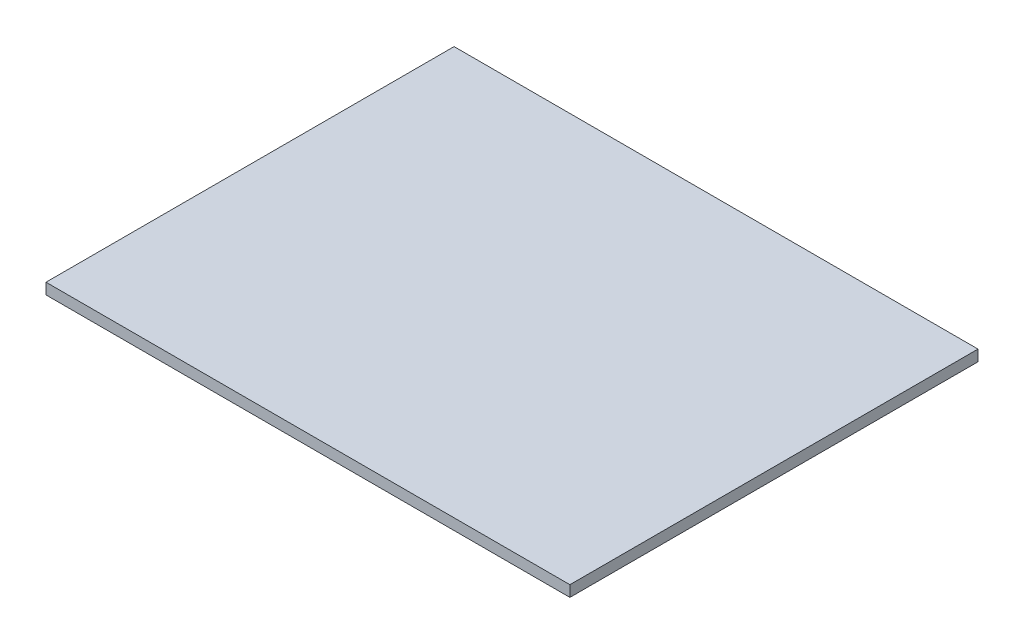
ISO-10303-21;
HEADER;
FILE_DESCRIPTION(('STEP AP214'),'2;1');
FILE_NAME('part.step','',(''),(''),'','','');
FILE_SCHEMA(('AUTOMOTIVE_DESIGN { 1 0 10303 214 1 1 1 1 }'));
ENDSEC;
DATA;
#1=APPLICATION_CONTEXT('core data for automotive mechanical design processes');
#2=APPLICATION_PROTOCOL_DEFINITION('international standard','automotive_design',2000,#1);
#3=PRODUCT_CONTEXT('',#1,'mechanical');
#4=PRODUCT('Part','Part','',(#3));
#5=PRODUCT_RELATED_PRODUCT_CATEGORY('part','',(#4));
#6=PRODUCT_DEFINITION_FORMATION('','',#4);
#7=PRODUCT_DEFINITION_CONTEXT('part definition',#1,'design');
#8=PRODUCT_DEFINITION('design','',#6,#7);
#9=PRODUCT_DEFINITION_SHAPE('','',#8);
#10=(LENGTH_UNIT() NAMED_UNIT(*) SI_UNIT(.MILLI.,.METRE.));
#11=(NAMED_UNIT(*) PLANE_ANGLE_UNIT() SI_UNIT($,.RADIAN.));
#12=(NAMED_UNIT(*) SI_UNIT($,.STERADIAN.) SOLID_ANGLE_UNIT());
#13=UNCERTAINTY_MEASURE_WITH_UNIT(LENGTH_MEASURE(1.E-05),#10,'distance_accuracy_value','');
#14=(GEOMETRIC_REPRESENTATION_CONTEXT(3) GLOBAL_UNCERTAINTY_ASSIGNED_CONTEXT((#13)) GLOBAL_UNIT_ASSIGNED_CONTEXT((#10,
#11,#12)) REPRESENTATION_CONTEXT('',''));
#15=CARTESIAN_POINT('',(0.,0.,0.));
#16=DIRECTION('',(0.,0.,1.));
#17=DIRECTION('',(1.,0.,0.));
#18=AXIS2_PLACEMENT_3D('',#15,#16,#17);
#19=CARTESIAN_POINT('',(237.5,10.,-185.));
#20=DIRECTION('',(-1.,0.,0.));
#21=DIRECTION('',(0.,0.,1.));
#22=AXIS2_PLACEMENT_3D('',#19,#20,#21);
#23=PLANE('',#22);
#24=DIRECTION('',(0.,0.,-1.));
#25=VECTOR('',#24,1.);
#26=CARTESIAN_POINT('',(237.5,0.,-185.));
#27=LINE('',#26,#25);
#28=CARTESIAN_POINT('',(237.5,0.,185.));
#29=VERTEX_POINT('',#28);
#30=CARTESIAN_POINT('',(237.5,0.,-185.));
#31=VERTEX_POINT('',#30);
#32=EDGE_CURVE('E97',#29,#31,#27,.T.);
#33=ORIENTED_EDGE('',*,*,#32,.T.);
#34=DIRECTION('',(0.,-1.,0.));
#35=VECTOR('',#34,1.);
#36=CARTESIAN_POINT('',(237.5,10.,-185.));
#37=LINE('',#36,#35);
#38=CARTESIAN_POINT('',(237.5,10.,-185.));
#39=VERTEX_POINT('',#38);
#40=EDGE_CURVE('E11',#39,#31,#37,.T.);
#41=ORIENTED_EDGE('',*,*,#40,.F.);
#42=DIRECTION('',(0.,0.,-1.));
#43=VECTOR('',#42,1.);
#44=CARTESIAN_POINT('',(237.5,10.,-185.));
#45=LINE('',#44,#43);
#46=CARTESIAN_POINT('',(237.5,10.,185.));
#47=VERTEX_POINT('',#46);
#48=EDGE_CURVE('E85',#47,#39,#45,.T.);
#49=ORIENTED_EDGE('',*,*,#48,.F.);
#50=DIRECTION('',(0.,-1.,0.));
#51=VECTOR('',#50,1.);
#52=CARTESIAN_POINT('',(237.5,10.,185.));
#53=LINE('',#52,#51);
#54=EDGE_CURVE('E93',#47,#29,#53,.T.);
#55=ORIENTED_EDGE('',*,*,#54,.T.);
#56=EDGE_LOOP('',(#33,#41,#49,#55));
#57=FACE_BOUND('',#56,.T.);
#58=ADVANCED_FACE('F34',(#57),#23,.F.);
#59=CARTESIAN_POINT('',(-237.5,10.,-185.));
#60=DIRECTION('',(0.,0.,1.));
#61=DIRECTION('',(1.,0.,0.));
#62=AXIS2_PLACEMENT_3D('',#59,#60,#61);
#63=PLANE('',#62);
#64=DIRECTION('',(-1.,0.,0.));
#65=VECTOR('',#64,1.);
#66=CARTESIAN_POINT('',(-237.5,0.,-185.));
#67=LINE('',#66,#65);
#68=CARTESIAN_POINT('',(-237.5,0.,-185.));
#69=VERTEX_POINT('',#68);
#70=EDGE_CURVE('E89',#31,#69,#67,.T.);
#71=ORIENTED_EDGE('',*,*,#70,.T.);
#72=DIRECTION('',(0.,-1.,0.));
#73=VECTOR('',#72,1.);
#74=CARTESIAN_POINT('',(-237.5,10.,-185.));
#75=LINE('',#74,#73);
#76=CARTESIAN_POINT('',(-237.5,10.,-185.));
#77=VERTEX_POINT('',#76);
#78=EDGE_CURVE('E42',#77,#69,#75,.T.);
#79=ORIENTED_EDGE('',*,*,#78,.F.);
#80=DIRECTION('',(-1.,0.,0.));
#81=VECTOR('',#80,1.);
#82=CARTESIAN_POINT('',(-237.5,10.,-185.));
#83=LINE('',#82,#81);
#84=EDGE_CURVE('E80',#39,#77,#83,.T.);
#85=ORIENTED_EDGE('',*,*,#84,.F.);
#86=ORIENTED_EDGE('',*,*,#40,.T.);
#87=EDGE_LOOP('',(#71,#79,#85,#86));
#88=FACE_BOUND('',#87,.T.);
#89=ADVANCED_FACE('F88',(#88),#63,.F.);
#90=CARTESIAN_POINT('',(-237.5,10.,-185.));
#91=DIRECTION('',(1.,0.,0.));
#92=DIRECTION('',(0.,0.,-1.));
#93=AXIS2_PLACEMENT_3D('',#90,#91,#92);
#94=PLANE('',#93);
#95=DIRECTION('',(0.,0.,1.));
#96=VECTOR('',#95,1.);
#97=CARTESIAN_POINT('',(-237.5,0.,-185.));
#98=LINE('',#97,#96);
#99=CARTESIAN_POINT('',(-237.5,0.,185.));
#100=VERTEX_POINT('',#99);
#101=EDGE_CURVE('E67',#69,#100,#98,.T.);
#102=ORIENTED_EDGE('',*,*,#101,.T.);
#103=DIRECTION('',(0.,-1.,0.));
#104=VECTOR('',#103,1.);
#105=CARTESIAN_POINT('',(-237.5,10.,185.));
#106=LINE('',#105,#104);
#107=CARTESIAN_POINT('',(-237.5,10.,185.));
#108=VERTEX_POINT('',#107);
#109=EDGE_CURVE('E90',#108,#100,#106,.T.);
#110=ORIENTED_EDGE('',*,*,#109,.F.);
#111=DIRECTION('',(0.,0.,1.));
#112=VECTOR('',#111,1.);
#113=CARTESIAN_POINT('',(-237.5,10.,-185.));
#114=LINE('',#113,#112);
#115=EDGE_CURVE('E83',#77,#108,#114,.T.);
#116=ORIENTED_EDGE('',*,*,#115,.F.);
#117=ORIENTED_EDGE('',*,*,#78,.T.);
#118=EDGE_LOOP('',(#102,#110,#116,#117));
#119=FACE_BOUND('',#118,.T.);
#120=ADVANCED_FACE('F91',(#119),#94,.F.);
#121=CARTESIAN_POINT('',(-237.5,10.,185.));
#122=DIRECTION('',(0.,0.,-1.));
#123=DIRECTION('',(-1.,0.,0.));
#124=AXIS2_PLACEMENT_3D('',#121,#122,#123);
#125=PLANE('',#124);
#126=DIRECTION('',(1.,0.,0.));
#127=VECTOR('',#126,1.);
#128=CARTESIAN_POINT('',(-237.5,0.,185.));
#129=LINE('',#128,#127);
#130=EDGE_CURVE('E73',#100,#29,#129,.T.);
#131=ORIENTED_EDGE('',*,*,#130,.T.);
#132=ORIENTED_EDGE('',*,*,#54,.F.);
#133=DIRECTION('',(1.,0.,0.));
#134=VECTOR('',#133,1.);
#135=CARTESIAN_POINT('',(-237.5,10.,185.));
#136=LINE('',#135,#134);
#137=EDGE_CURVE('E50',#108,#47,#136,.T.);
#138=ORIENTED_EDGE('',*,*,#137,.F.);
#139=ORIENTED_EDGE('',*,*,#109,.T.);
#140=EDGE_LOOP('',(#131,#132,#138,#139));
#141=FACE_BOUND('',#140,.T.);
#142=ADVANCED_FACE('F104',(#141),#125,.F.);
#143=CARTESIAN_POINT('',(0.,10.,0.));
#144=DIRECTION('',(0.,1.,0.));
#145=DIRECTION('',(0.,0.,1.));
#146=AXIS2_PLACEMENT_3D('',#143,#144,#145);
#147=PLANE('',#146);
#148=ORIENTED_EDGE('',*,*,#48,.T.);
#149=ORIENTED_EDGE('',*,*,#84,.T.);
#150=ORIENTED_EDGE('',*,*,#115,.T.);
#151=ORIENTED_EDGE('',*,*,#137,.T.);
#152=EDGE_LOOP('',(#148,#149,#150,#151));
#153=FACE_BOUND('',#152,.T.);
#154=ADVANCED_FACE('F81',(#153),#147,.T.);
#155=CARTESIAN_POINT('',(0.,0.,0.));
#156=DIRECTION('',(0.,1.,0.));
#157=DIRECTION('',(0.,0.,1.));
#158=AXIS2_PLACEMENT_3D('',#155,#156,#157);
#159=PLANE('',#158);
#160=ORIENTED_EDGE('',*,*,#32,.F.);
#161=ORIENTED_EDGE('',*,*,#130,.F.);
#162=ORIENTED_EDGE('',*,*,#101,.F.);
#163=ORIENTED_EDGE('',*,*,#70,.F.);
#164=EDGE_LOOP('',(#160,#161,#162,#163));
#165=FACE_BOUND('',#164,.T.);
#166=ADVANCED_FACE('F107',(#165),#159,.F.);
#167=CLOSED_SHELL('',(#58,#89,#120,#142,#154,#166));
#168=MANIFOLD_SOLID_BREP('B2',#167);
#169=ADVANCED_BREP_SHAPE_REPRESENTATION('',(#18,#168),#14);
#170=SHAPE_DEFINITION_REPRESENTATION(#9,#169);
ENDSEC;
END-ISO-10303-21;
